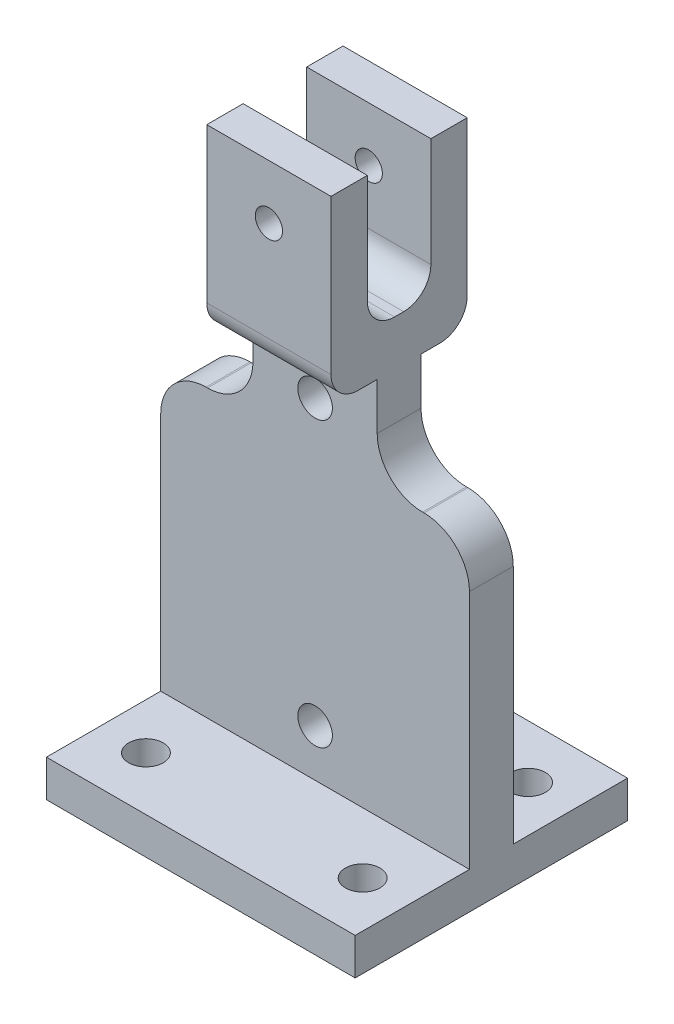
ISO-10303-21;
HEADER;
FILE_DESCRIPTION(('STEP AP214'),'2;1');
FILE_NAME('part.step','',(''),(''),'','','');
FILE_SCHEMA(('AUTOMOTIVE_DESIGN { 1 0 10303 214 1 1 1 1 }'));
ENDSEC;
DATA;
#1=APPLICATION_CONTEXT('core data for automotive mechanical design processes');
#2=APPLICATION_PROTOCOL_DEFINITION('international standard','automotive_design',2000,#1);
#3=PRODUCT_CONTEXT('',#1,'mechanical');
#4=PRODUCT('Part','Part','',(#3));
#5=PRODUCT_RELATED_PRODUCT_CATEGORY('part','',(#4));
#6=PRODUCT_DEFINITION_FORMATION('','',#4);
#7=PRODUCT_DEFINITION_CONTEXT('part definition',#1,'design');
#8=PRODUCT_DEFINITION('design','',#6,#7);
#9=PRODUCT_DEFINITION_SHAPE('','',#8);
#10=(LENGTH_UNIT() NAMED_UNIT(*) SI_UNIT(.MILLI.,.METRE.));
#11=(NAMED_UNIT(*) PLANE_ANGLE_UNIT() SI_UNIT($,.RADIAN.));
#12=(NAMED_UNIT(*) SI_UNIT($,.STERADIAN.) SOLID_ANGLE_UNIT());
#13=UNCERTAINTY_MEASURE_WITH_UNIT(LENGTH_MEASURE(1.E-05),#10,'distance_accuracy_value','');
#14=(GEOMETRIC_REPRESENTATION_CONTEXT(3) GLOBAL_UNCERTAINTY_ASSIGNED_CONTEXT((#13)) GLOBAL_UNIT_ASSIGNED_CONTEXT((#10,
#11,#12)) REPRESENTATION_CONTEXT('',''));
#15=CARTESIAN_POINT('',(0.,0.,0.));
#16=DIRECTION('',(0.,0.,1.));
#17=DIRECTION('',(1.,0.,0.));
#18=AXIS2_PLACEMENT_3D('',#15,#16,#17);
#19=CARTESIAN_POINT('',(-6.84,0.,2.413));
#20=DIRECTION('',(1.,0.,0.));
#21=DIRECTION('',(0.,0.,-1.));
#22=AXIS2_PLACEMENT_3D('',#19,#20,#21);
#23=PLANE('',#22);
#24=DIRECTION('',(0.,0.,1.));
#25=VECTOR('',#24,1.);
#26=CARTESIAN_POINT('',(-6.84,41.656,0.));
#27=LINE('',#26,#25);
#28=CARTESIAN_POINT('',(-6.84,41.656,2.413));
#29=VERTEX_POINT('',#28);
#30=CARTESIAN_POINT('',(-6.84,41.656,4.5));
#31=VERTEX_POINT('',#30);
#32=EDGE_CURVE('E302',#29,#31,#27,.T.);
#33=ORIENTED_EDGE('',*,*,#32,.T.);
#34=CARTESIAN_POINT('',(-6.84,44.656,4.5));
#35=DIRECTION('',(1.,0.,0.));
#36=DIRECTION('',(0.,0.,-1.));
#37=AXIS2_PLACEMENT_3D('',#34,#35,#36);
#38=CIRCLE('',#37,3.);
#39=CARTESIAN_POINT('',(-6.84,44.656,7.5));
#40=VERTEX_POINT('',#39);
#41=EDGE_CURVE('E528',#31,#40,#38,.F.);
#42=ORIENTED_EDGE('',*,*,#41,.T.);
#43=DIRECTION('',(0.,-1.,0.));
#44=VECTOR('',#43,1.);
#45=CARTESIAN_POINT('',(-6.84,61.656,7.5));
#46=LINE('',#45,#44);
#47=CARTESIAN_POINT('',(-6.84,61.656,7.5));
#48=VERTEX_POINT('',#47);
#49=EDGE_CURVE('E280',#48,#40,#46,.T.);
#50=ORIENTED_EDGE('',*,*,#49,.F.);
#51=DIRECTION('',(0.,0.,1.));
#52=VECTOR('',#51,1.);
#53=CARTESIAN_POINT('',(-6.84,61.656,0.));
#54=LINE('',#53,#52);
#55=CARTESIAN_POINT('',(-6.84,61.656,3.5));
#56=VERTEX_POINT('',#55);
#57=EDGE_CURVE('E258',#56,#48,#54,.T.);
#58=ORIENTED_EDGE('',*,*,#57,.F.);
#59=DIRECTION('',(0.,-1.,0.));
#60=VECTOR('',#59,1.);
#61=CARTESIAN_POINT('',(-6.84,61.656,3.5));
#62=LINE('',#61,#60);
#63=CARTESIAN_POINT('',(-6.84,49.656,3.5));
#64=VERTEX_POINT('',#63);
#65=EDGE_CURVE('E284',#56,#64,#62,.T.);
#66=ORIENTED_EDGE('',*,*,#65,.T.);
#67=CARTESIAN_POINT('',(-6.84,49.656,0.500000000000001));
#68=DIRECTION('',(1.,0.,0.));
#69=DIRECTION('',(0.,0.,-1.));
#70=AXIS2_PLACEMENT_3D('',#67,#68,#69);
#71=CIRCLE('',#70,3.);
#72=CARTESIAN_POINT('',(-6.84,46.656,0.500000000000001));
#73=VERTEX_POINT('',#72);
#74=EDGE_CURVE('E553',#64,#73,#71,.T.);
#75=ORIENTED_EDGE('',*,*,#74,.T.);
#76=DIRECTION('',(0.,0.,1.));
#77=VECTOR('',#76,1.);
#78=CARTESIAN_POINT('',(-6.84,46.656,0.));
#79=LINE('',#78,#77);
#80=CARTESIAN_POINT('',(-6.84,46.656,-0.499999999999998));
#81=VERTEX_POINT('',#80);
#82=EDGE_CURVE('E293',#81,#73,#79,.T.);
#83=ORIENTED_EDGE('',*,*,#82,.F.);
#84=CARTESIAN_POINT('',(-6.84,49.656,-0.499999999999998));
#85=DIRECTION('',(1.,0.,0.));
#86=DIRECTION('',(0.,0.,-1.));
#87=AXIS2_PLACEMENT_3D('',#84,#85,#86);
#88=CIRCLE('',#87,3.);
#89=CARTESIAN_POINT('',(-6.84,49.656,-3.5));
#90=VERTEX_POINT('',#89);
#91=EDGE_CURVE('E11',#81,#90,#88,.T.);
#92=ORIENTED_EDGE('',*,*,#91,.T.);
#93=DIRECTION('',(0.,-1.,0.));
#94=VECTOR('',#93,1.);
#95=CARTESIAN_POINT('',(-6.84,61.656,-3.5));
#96=LINE('',#95,#94);
#97=CARTESIAN_POINT('',(-6.84,61.656,-3.5));
#98=VERTEX_POINT('',#97);
#99=EDGE_CURVE('E231',#98,#90,#96,.T.);
#100=ORIENTED_EDGE('',*,*,#99,.F.);
#101=DIRECTION('',(0.,0.,1.));
#102=VECTOR('',#101,1.);
#103=CARTESIAN_POINT('',(-6.84,61.656,0.));
#104=LINE('',#103,#102);
#105=CARTESIAN_POINT('',(-6.84,61.656,-7.5));
#106=VERTEX_POINT('',#105);
#107=EDGE_CURVE('E239',#106,#98,#104,.T.);
#108=ORIENTED_EDGE('',*,*,#107,.F.);
#109=DIRECTION('',(0.,-1.,0.));
#110=VECTOR('',#109,1.);
#111=CARTESIAN_POINT('',(-6.84,61.656,-7.5));
#112=LINE('',#111,#110);
#113=CARTESIAN_POINT('',(-6.84,44.656,-7.5));
#114=VERTEX_POINT('',#113);
#115=EDGE_CURVE('E1070',#106,#114,#112,.T.);
#116=ORIENTED_EDGE('',*,*,#115,.T.);
#117=CARTESIAN_POINT('',(-6.84,44.656,-4.5));
#118=DIRECTION('',(1.,0.,0.));
#119=DIRECTION('',(0.,0.,-1.));
#120=AXIS2_PLACEMENT_3D('',#117,#118,#119);
#121=CIRCLE('',#120,3.);
#122=CARTESIAN_POINT('',(-6.84,41.656,-4.5));
#123=VERTEX_POINT('',#122);
#124=EDGE_CURVE('E57',#114,#123,#121,.F.);
#125=ORIENTED_EDGE('',*,*,#124,.T.);
#126=CARTESIAN_POINT('',(-6.84,41.656,-2.413));
#127=VERTEX_POINT('',#126);
#128=EDGE_CURVE('E294',#123,#127,#27,.T.);
#129=ORIENTED_EDGE('',*,*,#128,.T.);
#130=DIRECTION('',(0.,-1.,0.));
#131=VECTOR('',#130,1.);
#132=CARTESIAN_POINT('',(-6.84,0.,-2.413));
#133=LINE('',#132,#131);
#134=CARTESIAN_POINT('',(-6.84,36.496,-2.413));
#135=VERTEX_POINT('',#134);
#136=EDGE_CURVE('E432',#127,#135,#133,.T.);
#137=ORIENTED_EDGE('',*,*,#136,.T.);
#138=DIRECTION('',(0.,0.,-1.));
#139=VECTOR('',#138,1.);
#140=CARTESIAN_POINT('',(-6.84,36.496,2.413));
#141=LINE('',#140,#139);
#142=CARTESIAN_POINT('',(-6.84,36.496,2.413));
#143=VERTEX_POINT('',#142);
#144=EDGE_CURVE('E468',#135,#143,#141,.F.);
#145=ORIENTED_EDGE('',*,*,#144,.T.);
#146=DIRECTION('',(0.,-1.,0.));
#147=VECTOR('',#146,1.);
#148=CARTESIAN_POINT('',(-6.84,0.,2.413));
#149=LINE('',#148,#147);
#150=EDGE_CURVE('E392',#29,#143,#149,.T.);
#151=ORIENTED_EDGE('',*,*,#150,.F.);
#152=EDGE_LOOP('',(#33,#42,#50,#58,#66,#75,#83,#92,#100,#108,#116,#125,#129,#137,#145,#151));
#153=FACE_BOUND('',#152,.T.);
#154=ADVANCED_FACE('F41',(#153),#23,.F.);
#155=CARTESIAN_POINT('',(0.,31.496,2.413));
#156=DIRECTION('',(0.,-1.,0.));
#157=DIRECTION('',(0.,0.,-1.));
#158=AXIS2_PLACEMENT_3D('',#155,#156,#157);
#159=PLANE('',#158);
#160=DIRECTION('',(-1.,0.,0.));
#161=VECTOR('',#160,1.);
#162=CARTESIAN_POINT('',(0.,31.496,2.413));
#163=LINE('',#162,#161);
#164=CARTESIAN_POINT('',(-11.84,31.496,2.413));
#165=VERTEX_POINT('',#164);
#166=CARTESIAN_POINT('',(-12.,31.496,2.413));
#167=VERTEX_POINT('',#166);
#168=EDGE_CURVE('E396',#165,#167,#163,.T.);
#169=ORIENTED_EDGE('',*,*,#168,.F.);
#170=DIRECTION('',(0.,0.,-1.));
#171=VECTOR('',#170,1.);
#172=CARTESIAN_POINT('',(-11.84,31.496,-2.413));
#173=LINE('',#172,#171);
#174=CARTESIAN_POINT('',(-11.84,31.496,-2.413));
#175=VERTEX_POINT('',#174);
#176=EDGE_CURVE('E464',#165,#175,#173,.T.);
#177=ORIENTED_EDGE('',*,*,#176,.T.);
#178=DIRECTION('',(-1.,0.,0.));
#179=VECTOR('',#178,1.);
#180=CARTESIAN_POINT('',(0.,31.496,-2.413));
#181=LINE('',#180,#179);
#182=CARTESIAN_POINT('',(-12.,31.496,-2.413));
#183=VERTEX_POINT('',#182);
#184=EDGE_CURVE('E436',#175,#183,#181,.T.);
#185=ORIENTED_EDGE('',*,*,#184,.T.);
#186=DIRECTION('',(0.,0.,-1.));
#187=VECTOR('',#186,1.);
#188=CARTESIAN_POINT('',(-12.,31.496,2.413));
#189=LINE('',#188,#187);
#190=EDGE_CURVE('E424',#183,#167,#189,.F.);
#191=ORIENTED_EDGE('',*,*,#190,.T.);
#192=EDGE_LOOP('',(#169,#177,#185,#191));
#193=FACE_BOUND('',#192,.T.);
#194=ADVANCED_FACE('F575',(#193),#159,.F.);
#195=CARTESIAN_POINT('',(-17.,0.,2.413));
#196=DIRECTION('',(-1.,0.,0.));
#197=DIRECTION('',(0.,-1.,0.));
#198=AXIS2_PLACEMENT_3D('',#195,#196,#197);
#199=PLANE('',#198);
#200=DIRECTION('',(0.,1.,0.));
#201=VECTOR('',#200,1.);
#202=CARTESIAN_POINT('',(-17.,0.,2.413));
#203=LINE('',#202,#201);
#204=CARTESIAN_POINT('',(-17.,0.,2.413));
#205=VERTEX_POINT('',#204);
#206=CARTESIAN_POINT('',(-17.,26.496,2.413));
#207=VERTEX_POINT('',#206);
#208=EDGE_CURVE('E400',#205,#207,#203,.T.);
#209=ORIENTED_EDGE('',*,*,#208,.T.);
#210=DIRECTION('',(0.,0.,-1.));
#211=VECTOR('',#210,1.);
#212=CARTESIAN_POINT('',(-17.,26.496,-2.413));
#213=LINE('',#212,#211);
#214=CARTESIAN_POINT('',(-17.,26.496,-2.413));
#215=VERTEX_POINT('',#214);
#216=EDGE_CURVE('E482',#207,#215,#213,.T.);
#217=ORIENTED_EDGE('',*,*,#216,.T.);
#218=DIRECTION('',(0.,1.,0.));
#219=VECTOR('',#218,1.);
#220=CARTESIAN_POINT('',(-17.,0.,-2.413));
#221=LINE('',#220,#219);
#222=CARTESIAN_POINT('',(-17.,0.,-2.41299999999999));
#223=VERTEX_POINT('',#222);
#224=EDGE_CURVE('E440',#223,#215,#221,.T.);
#225=ORIENTED_EDGE('',*,*,#224,.F.);
#226=DIRECTION('',(0.,0.,1.));
#227=VECTOR('',#226,1.);
#228=CARTESIAN_POINT('',(-17.,0.,15.));
#229=LINE('',#228,#227);
#230=CARTESIAN_POINT('',(-17.,0.,-15.));
#231=VERTEX_POINT('',#230);
#232=EDGE_CURVE('E363',#231,#223,#229,.T.);
#233=ORIENTED_EDGE('',*,*,#232,.F.);
#234=DIRECTION('',(0.,1.,0.));
#235=VECTOR('',#234,1.);
#236=CARTESIAN_POINT('',(-17.,-4.064,-15.));
#237=LINE('',#236,#235);
#238=CARTESIAN_POINT('',(-17.,-4.064,-15.));
#239=VERTEX_POINT('',#238);
#240=EDGE_CURVE('E377',#239,#231,#237,.T.);
#241=ORIENTED_EDGE('',*,*,#240,.F.);
#242=DIRECTION('',(0.,0.,1.));
#243=VECTOR('',#242,1.);
#244=CARTESIAN_POINT('',(-17.,-4.064,15.));
#245=LINE('',#244,#243);
#246=CARTESIAN_POINT('',(-17.,-4.064,15.));
#247=VERTEX_POINT('',#246);
#248=EDGE_CURVE('E346',#239,#247,#245,.T.);
#249=ORIENTED_EDGE('',*,*,#248,.T.);
#250=DIRECTION('',(0.,1.,0.));
#251=VECTOR('',#250,1.);
#252=CARTESIAN_POINT('',(-17.,-4.064,15.));
#253=LINE('',#252,#251);
#254=CARTESIAN_POINT('',(-17.,0.,15.));
#255=VERTEX_POINT('',#254);
#256=EDGE_CURVE('E373',#247,#255,#253,.T.);
#257=ORIENTED_EDGE('',*,*,#256,.T.);
#258=EDGE_CURVE('E362',#205,#255,#229,.T.);
#259=ORIENTED_EDGE('',*,*,#258,.F.);
#260=EDGE_LOOP('',(#209,#217,#225,#233,#241,#249,#257,#259));
#261=FACE_BOUND('',#260,.T.);
#262=ADVANCED_FACE('F580',(#261),#199,.T.);
#263=CARTESIAN_POINT('',(17.,0.,2.413));
#264=DIRECTION('',(-1.,0.,0.));
#265=DIRECTION('',(0.,-1.,0.));
#266=AXIS2_PLACEMENT_3D('',#263,#264,#265);
#267=PLANE('',#266);
#268=DIRECTION('',(0.,1.,0.));
#269=VECTOR('',#268,1.);
#270=CARTESIAN_POINT('',(17.,0.,-2.413));
#271=LINE('',#270,#269);
#272=CARTESIAN_POINT('',(17.,0.,-2.413));
#273=VERTEX_POINT('',#272);
#274=CARTESIAN_POINT('',(17.,26.496,-2.413));
#275=VERTEX_POINT('',#274);
#276=EDGE_CURVE('E447',#273,#275,#271,.T.);
#277=ORIENTED_EDGE('',*,*,#276,.T.);
#278=DIRECTION('',(0.,0.,-1.));
#279=VECTOR('',#278,1.);
#280=CARTESIAN_POINT('',(17.,26.496,2.413));
#281=LINE('',#280,#279);
#282=CARTESIAN_POINT('',(17.,26.496,2.413));
#283=VERTEX_POINT('',#282);
#284=EDGE_CURVE('E498',#275,#283,#281,.F.);
#285=ORIENTED_EDGE('',*,*,#284,.T.);
#286=DIRECTION('',(0.,1.,0.));
#287=VECTOR('',#286,1.);
#288=CARTESIAN_POINT('',(17.,0.,2.413));
#289=LINE('',#288,#287);
#290=CARTESIAN_POINT('',(17.,0.,2.413));
#291=VERTEX_POINT('',#290);
#292=EDGE_CURVE('E408',#291,#283,#289,.T.);
#293=ORIENTED_EDGE('',*,*,#292,.F.);
#294=DIRECTION('',(0.,0.,-1.));
#295=VECTOR('',#294,1.);
#296=CARTESIAN_POINT('',(17.,0.,15.));
#297=LINE('',#296,#295);
#298=CARTESIAN_POINT('',(17.,0.,15.));
#299=VERTEX_POINT('',#298);
#300=EDGE_CURVE('E355',#299,#291,#297,.T.);
#301=ORIENTED_EDGE('',*,*,#300,.F.);
#302=DIRECTION('',(0.,1.,0.));
#303=VECTOR('',#302,1.);
#304=CARTESIAN_POINT('',(17.,-4.064,15.));
#305=LINE('',#304,#303);
#306=CARTESIAN_POINT('',(17.,-4.064,15.));
#307=VERTEX_POINT('',#306);
#308=EDGE_CURVE('E369',#307,#299,#305,.T.);
#309=ORIENTED_EDGE('',*,*,#308,.F.);
#310=DIRECTION('',(0.,0.,-1.));
#311=VECTOR('',#310,1.);
#312=CARTESIAN_POINT('',(17.,-4.064,15.));
#313=LINE('',#312,#311);
#314=CARTESIAN_POINT('',(17.,-4.064,-15.));
#315=VERTEX_POINT('',#314);
#316=EDGE_CURVE('E337',#307,#315,#313,.T.);
#317=ORIENTED_EDGE('',*,*,#316,.T.);
#318=DIRECTION('',(0.,1.,0.));
#319=VECTOR('',#318,1.);
#320=CARTESIAN_POINT('',(17.,-4.064,-15.));
#321=LINE('',#320,#319);
#322=CARTESIAN_POINT('',(17.,0.,-15.));
#323=VERTEX_POINT('',#322);
#324=EDGE_CURVE('E354',#315,#323,#321,.T.);
#325=ORIENTED_EDGE('',*,*,#324,.T.);
#326=EDGE_CURVE('E333',#273,#323,#297,.T.);
#327=ORIENTED_EDGE('',*,*,#326,.F.);
#328=EDGE_LOOP('',(#277,#285,#293,#301,#309,#317,#325,#327));
#329=FACE_BOUND('',#328,.T.);
#330=ADVANCED_FACE('F701',(#329),#267,.F.);
#331=CARTESIAN_POINT('',(0.,31.496,2.413));
#332=DIRECTION('',(0.,-1.,0.));
#333=DIRECTION('',(0.,0.,-1.));
#334=AXIS2_PLACEMENT_3D('',#331,#332,#333);
#335=PLANE('',#334);
#336=DIRECTION('',(-1.,0.,0.));
#337=VECTOR('',#336,1.);
#338=CARTESIAN_POINT('',(0.,31.496,-2.413));
#339=LINE('',#338,#337);
#340=CARTESIAN_POINT('',(12.,31.496,-2.413));
#341=VERTEX_POINT('',#340);
#342=CARTESIAN_POINT('',(11.84,31.496,-2.413));
#343=VERTEX_POINT('',#342);
#344=EDGE_CURVE('E451',#341,#343,#339,.T.);
#345=ORIENTED_EDGE('',*,*,#344,.T.);
#346=DIRECTION('',(0.,0.,-1.));
#347=VECTOR('',#346,1.);
#348=CARTESIAN_POINT('',(11.84,31.496,2.413));
#349=LINE('',#348,#347);
#350=CARTESIAN_POINT('',(11.84,31.496,2.413));
#351=VERTEX_POINT('',#350);
#352=EDGE_CURVE('E479',#343,#351,#349,.F.);
#353=ORIENTED_EDGE('',*,*,#352,.T.);
#354=DIRECTION('',(-1.,0.,0.));
#355=VECTOR('',#354,1.);
#356=CARTESIAN_POINT('',(0.,31.496,2.413));
#357=LINE('',#356,#355);
#358=CARTESIAN_POINT('',(12.,31.496,2.413));
#359=VERTEX_POINT('',#358);
#360=EDGE_CURVE('E412',#359,#351,#357,.T.);
#361=ORIENTED_EDGE('',*,*,#360,.F.);
#362=DIRECTION('',(0.,0.,-1.));
#363=VECTOR('',#362,1.);
#364=CARTESIAN_POINT('',(12.,31.496,2.413));
#365=LINE('',#364,#363);
#366=EDGE_CURVE('E475',#359,#341,#365,.T.);
#367=ORIENTED_EDGE('',*,*,#366,.T.);
#368=EDGE_LOOP('',(#345,#353,#361,#367));
#369=FACE_BOUND('',#368,.T.);
#370=ADVANCED_FACE('F698',(#369),#335,.F.);
#371=CARTESIAN_POINT('',(6.84,0.,2.413));
#372=DIRECTION('',(-1.,0.,0.));
#373=DIRECTION('',(0.,0.,1.));
#374=AXIS2_PLACEMENT_3D('',#371,#372,#373);
#375=PLANE('',#374);
#376=DIRECTION('',(0.,-1.,0.));
#377=VECTOR('',#376,1.);
#378=CARTESIAN_POINT('',(6.84,61.656,7.5));
#379=LINE('',#378,#377);
#380=CARTESIAN_POINT('',(6.84,61.656,7.5));
#381=VERTEX_POINT('',#380);
#382=CARTESIAN_POINT('',(6.84,44.656,7.5));
#383=VERTEX_POINT('',#382);
#384=EDGE_CURVE('E276',#381,#383,#379,.T.);
#385=ORIENTED_EDGE('',*,*,#384,.T.);
#386=CARTESIAN_POINT('',(6.84,44.656,4.5));
#387=DIRECTION('',(-1.,0.,0.));
#388=DIRECTION('',(0.,0.,1.));
#389=AXIS2_PLACEMENT_3D('',#386,#387,#388);
#390=CIRCLE('',#389,3.);
#391=CARTESIAN_POINT('',(6.84,41.656,4.5));
#392=VERTEX_POINT('',#391);
#393=EDGE_CURVE('E520',#383,#392,#390,.F.);
#394=ORIENTED_EDGE('',*,*,#393,.T.);
#395=DIRECTION('',(0.,0.,-1.));
#396=VECTOR('',#395,1.);
#397=CARTESIAN_POINT('',(6.84,41.656,0.));
#398=LINE('',#397,#396);
#399=CARTESIAN_POINT('',(6.84,41.656,2.413));
#400=VERTEX_POINT('',#399);
#401=EDGE_CURVE('E299',#392,#400,#398,.T.);
#402=ORIENTED_EDGE('',*,*,#401,.T.);
#403=DIRECTION('',(0.,1.,0.));
#404=VECTOR('',#403,1.);
#405=CARTESIAN_POINT('',(6.84,0.,2.413));
#406=LINE('',#405,#404);
#407=CARTESIAN_POINT('',(6.84,36.496,2.413));
#408=VERTEX_POINT('',#407);
#409=EDGE_CURVE('E416',#408,#400,#406,.T.);
#410=ORIENTED_EDGE('',*,*,#409,.F.);
#411=DIRECTION('',(0.,0.,-1.));
#412=VECTOR('',#411,1.);
#413=CARTESIAN_POINT('',(6.84,36.496,-2.413));
#414=LINE('',#413,#412);
#415=CARTESIAN_POINT('',(6.84,36.496,-2.413));
#416=VERTEX_POINT('',#415);
#417=EDGE_CURVE('E471',#408,#416,#414,.T.);
#418=ORIENTED_EDGE('',*,*,#417,.T.);
#419=DIRECTION('',(0.,1.,0.));
#420=VECTOR('',#419,1.);
#421=CARTESIAN_POINT('',(6.84,0.,-2.413));
#422=LINE('',#421,#420);
#423=CARTESIAN_POINT('',(6.84,41.656,-2.413));
#424=VERTEX_POINT('',#423);
#425=EDGE_CURVE('E455',#416,#424,#422,.T.);
#426=ORIENTED_EDGE('',*,*,#425,.T.);
#427=CARTESIAN_POINT('',(6.84,41.656,-4.5));
#428=VERTEX_POINT('',#427);
#429=EDGE_CURVE('E288',#424,#428,#398,.T.);
#430=ORIENTED_EDGE('',*,*,#429,.T.);
#431=CARTESIAN_POINT('',(6.84,44.656,-4.5));
#432=DIRECTION('',(-1.,0.,0.));
#433=DIRECTION('',(0.,0.,1.));
#434=AXIS2_PLACEMENT_3D('',#431,#432,#433);
#435=CIRCLE('',#434,3.);
#436=CARTESIAN_POINT('',(6.84,44.656,-7.5));
#437=VERTEX_POINT('',#436);
#438=EDGE_CURVE('E517',#428,#437,#435,.F.);
#439=ORIENTED_EDGE('',*,*,#438,.T.);
#440=DIRECTION('',(0.,-1.,0.));
#441=VECTOR('',#440,1.);
#442=CARTESIAN_POINT('',(6.84,61.656,-7.5));
#443=LINE('',#442,#441);
#444=CARTESIAN_POINT('',(6.84,61.656,-7.5));
#445=VERTEX_POINT('',#444);
#446=EDGE_CURVE('E260',#445,#437,#443,.T.);
#447=ORIENTED_EDGE('',*,*,#446,.F.);
#448=DIRECTION('',(0.,0.,-1.));
#449=VECTOR('',#448,1.);
#450=CARTESIAN_POINT('',(6.84,61.656,0.));
#451=LINE('',#450,#449);
#452=CARTESIAN_POINT('',(6.84,61.656,-3.5));
#453=VERTEX_POINT('',#452);
#454=EDGE_CURVE('E238',#453,#445,#451,.T.);
#455=ORIENTED_EDGE('',*,*,#454,.F.);
#456=DIRECTION('',(0.,-1.,0.));
#457=VECTOR('',#456,1.);
#458=CARTESIAN_POINT('',(6.84,61.656,-3.5));
#459=LINE('',#458,#457);
#460=CARTESIAN_POINT('',(6.84,49.656,-3.5));
#461=VERTEX_POINT('',#460);
#462=EDGE_CURVE('E234',#453,#461,#459,.T.);
#463=ORIENTED_EDGE('',*,*,#462,.T.);
#464=CARTESIAN_POINT('',(6.84,49.656,-0.499999999999998));
#465=DIRECTION('',(-1.,0.,0.));
#466=DIRECTION('',(0.,0.,1.));
#467=AXIS2_PLACEMENT_3D('',#464,#465,#466);
#468=CIRCLE('',#467,3.);
#469=CARTESIAN_POINT('',(6.84,46.656,-0.499999999999998));
#470=VERTEX_POINT('',#469);
#471=EDGE_CURVE('E50',#461,#470,#468,.T.);
#472=ORIENTED_EDGE('',*,*,#471,.T.);
#473=DIRECTION('',(0.,0.,-1.));
#474=VECTOR('',#473,1.);
#475=CARTESIAN_POINT('',(6.84,46.656,0.));
#476=LINE('',#475,#474);
#477=CARTESIAN_POINT('',(6.84,46.656,0.500000000000001));
#478=VERTEX_POINT('',#477);
#479=EDGE_CURVE('E289',#478,#470,#476,.T.);
#480=ORIENTED_EDGE('',*,*,#479,.F.);
#481=CARTESIAN_POINT('',(6.84,49.656,0.500000000000001));
#482=DIRECTION('',(-1.,0.,0.));
#483=DIRECTION('',(0.,0.,1.));
#484=AXIS2_PLACEMENT_3D('',#481,#482,#483);
#485=CIRCLE('',#484,3.);
#486=CARTESIAN_POINT('',(6.84,49.656,3.5));
#487=VERTEX_POINT('',#486);
#488=EDGE_CURVE('E550',#478,#487,#485,.T.);
#489=ORIENTED_EDGE('',*,*,#488,.T.);
#490=DIRECTION('',(0.,-1.,0.));
#491=VECTOR('',#490,1.);
#492=CARTESIAN_POINT('',(6.84,61.656,3.5));
#493=LINE('',#492,#491);
#494=CARTESIAN_POINT('',(6.84,61.656,3.5));
#495=VERTEX_POINT('',#494);
#496=EDGE_CURVE('E272',#495,#487,#493,.T.);
#497=ORIENTED_EDGE('',*,*,#496,.F.);
#498=DIRECTION('',(0.,0.,-1.));
#499=VECTOR('',#498,1.);
#500=CARTESIAN_POINT('',(6.84,61.656,0.));
#501=LINE('',#500,#499);
#502=EDGE_CURVE('E269',#381,#495,#501,.T.);
#503=ORIENTED_EDGE('',*,*,#502,.F.);
#504=EDGE_LOOP('',(#385,#394,#402,#410,#418,#426,#430,#439,#447,#455,#463,#472,#480,#489,#497,#503));
#505=FACE_BOUND('',#504,.T.);
#506=ADVANCED_FACE('F558',(#505),#375,.F.);
#507=CARTESIAN_POINT('',(0.,5.207,2.413));
#508=DIRECTION('',(0.,0.,-1.));
#509=DIRECTION('',(-1.,0.,0.));
#510=AXIS2_PLACEMENT_3D('',#507,#508,#509);
#511=CYLINDRICAL_SURFACE('',#510,1.905);
#512=CARTESIAN_POINT('',(0.,5.207,2.413));
#513=DIRECTION('',(0.,0.,1.));
#514=DIRECTION('',(1.,0.,0.));
#515=AXIS2_PLACEMENT_3D('',#512,#513,#514);
#516=CIRCLE('',#515,1.905);
#517=CARTESIAN_POINT('',(1.905,5.207,2.413));
#518=VERTEX_POINT('',#517);
#519=EDGE_CURVE('E387',#518,#518,#516,.T.);
#520=ORIENTED_EDGE('',*,*,#519,.T.);
#521=EDGE_LOOP('',(#520));
#522=FACE_BOUND('',#521,.T.);
#523=CARTESIAN_POINT('',(0.,5.207,-2.413));
#524=DIRECTION('',(0.,0.,1.));
#525=DIRECTION('',(1.,0.,0.));
#526=AXIS2_PLACEMENT_3D('',#523,#524,#525);
#527=CIRCLE('',#526,1.905);
#528=CARTESIAN_POINT('',(1.905,5.207,-2.413));
#529=VERTEX_POINT('',#528);
#530=EDGE_CURVE('E428',#529,#529,#527,.T.);
#531=ORIENTED_EDGE('',*,*,#530,.F.);
#532=EDGE_LOOP('',(#531));
#533=FACE_BOUND('',#532,.T.);
#534=ADVANCED_FACE('F585',(#522,#533),#511,.F.);
#535=CARTESIAN_POINT('',(0.,36.449,2.413));
#536=DIRECTION('',(0.,0.,-1.));
#537=DIRECTION('',(-1.,0.,0.));
#538=AXIS2_PLACEMENT_3D('',#535,#536,#537);
#539=CYLINDRICAL_SURFACE('',#538,1.905);
#540=CARTESIAN_POINT('',(0.,36.449,2.413));
#541=DIRECTION('',(0.,0.,1.));
#542=DIRECTION('',(1.,0.,0.));
#543=AXIS2_PLACEMENT_3D('',#540,#541,#542);
#544=CIRCLE('',#543,1.905);
#545=CARTESIAN_POINT('',(1.905,36.449,2.413));
#546=VERTEX_POINT('',#545);
#547=EDGE_CURVE('E383',#546,#546,#544,.T.);
#548=ORIENTED_EDGE('',*,*,#547,.T.);
#549=EDGE_LOOP('',(#548));
#550=FACE_BOUND('',#549,.T.);
#551=CARTESIAN_POINT('',(0.,36.449,-2.413));
#552=DIRECTION('',(0.,0.,1.));
#553=DIRECTION('',(1.,0.,0.));
#554=AXIS2_PLACEMENT_3D('',#551,#552,#553);
#555=CIRCLE('',#554,1.905);
#556=CARTESIAN_POINT('',(1.905,36.449,-2.413));
#557=VERTEX_POINT('',#556);
#558=EDGE_CURVE('E372',#557,#557,#555,.T.);
#559=ORIENTED_EDGE('',*,*,#558,.F.);
#560=EDGE_LOOP('',(#559));
#561=FACE_BOUND('',#560,.T.);
#562=ADVANCED_FACE('F588',(#550,#561),#539,.F.);
#563=CARTESIAN_POINT('',(0.,0.,2.413));
#564=DIRECTION('',(0.,0.,1.));
#565=DIRECTION('',(1.,0.,0.));
#566=AXIS2_PLACEMENT_3D('',#563,#564,#565);
#567=PLANE('',#566);
#568=ORIENTED_EDGE('',*,*,#547,.F.);
#569=EDGE_LOOP('',(#568));
#570=FACE_BOUND('',#569,.T.);
#571=ORIENTED_EDGE('',*,*,#519,.F.);
#572=EDGE_LOOP('',(#571));
#573=FACE_BOUND('',#572,.T.);
#574=ORIENTED_EDGE('',*,*,#168,.T.);
#575=CARTESIAN_POINT('',(-12.,26.496,2.413));
#576=DIRECTION('',(0.,0.,1.));
#577=DIRECTION('',(1.,0.,0.));
#578=AXIS2_PLACEMENT_3D('',#575,#576,#577);
#579=CIRCLE('',#578,5.);
#580=EDGE_CURVE('E495',#167,#207,#579,.T.);
#581=ORIENTED_EDGE('',*,*,#580,.T.);
#582=ORIENTED_EDGE('',*,*,#208,.F.);
#583=DIRECTION('',(1.,0.,0.));
#584=VECTOR('',#583,1.);
#585=CARTESIAN_POINT('',(0.,0.,2.413));
#586=LINE('',#585,#584);
#587=EDGE_CURVE('E404',#205,#291,#586,.T.);
#588=ORIENTED_EDGE('',*,*,#587,.T.);
#589=ORIENTED_EDGE('',*,*,#292,.T.);
#590=CARTESIAN_POINT('',(12.,26.496,2.413));
#591=DIRECTION('',(0.,0.,1.));
#592=DIRECTION('',(1.,0.,0.));
#593=AXIS2_PLACEMENT_3D('',#590,#591,#592);
#594=CIRCLE('',#593,5.);
#595=EDGE_CURVE('E492',#283,#359,#594,.T.);
#596=ORIENTED_EDGE('',*,*,#595,.T.);
#597=ORIENTED_EDGE('',*,*,#360,.T.);
#598=CARTESIAN_POINT('',(11.84,36.496,2.413));
#599=DIRECTION('',(0.,0.,1.));
#600=DIRECTION('',(1.,0.,0.));
#601=AXIS2_PLACEMENT_3D('',#598,#599,#600);
#602=CIRCLE('',#601,5.);
#603=EDGE_CURVE('E510',#351,#408,#602,.F.);
#604=ORIENTED_EDGE('',*,*,#603,.T.);
#605=ORIENTED_EDGE('',*,*,#409,.T.);
#606=DIRECTION('',(-1.,0.,0.));
#607=VECTOR('',#606,1.);
#608=CARTESIAN_POINT('',(0.,41.656,2.413));
#609=LINE('',#608,#607);
#610=EDGE_CURVE('E420',#400,#29,#609,.T.);
#611=ORIENTED_EDGE('',*,*,#610,.T.);
#612=ORIENTED_EDGE('',*,*,#150,.T.);
#613=CARTESIAN_POINT('',(-11.84,36.496,2.413));
#614=DIRECTION('',(0.,0.,1.));
#615=DIRECTION('',(1.,0.,0.));
#616=AXIS2_PLACEMENT_3D('',#613,#614,#615);
#617=CIRCLE('',#616,5.);
#618=EDGE_CURVE('E504',#143,#165,#617,.F.);
#619=ORIENTED_EDGE('',*,*,#618,.T.);
#620=EDGE_LOOP('',(#574,#581,#582,#588,#589,#596,#597,#604,#605,#611,#612,#619));
#621=FACE_BOUND('',#620,.T.);
#622=ADVANCED_FACE('F592',(#570,#573,#621),#567,.T.);
#623=CARTESIAN_POINT('',(0.,0.,-2.413));
#624=DIRECTION('',(0.,0.,1.));
#625=DIRECTION('',(1.,0.,0.));
#626=AXIS2_PLACEMENT_3D('',#623,#624,#625);
#627=PLANE('',#626);
#628=ORIENTED_EDGE('',*,*,#558,.T.);
#629=EDGE_LOOP('',(#628));
#630=FACE_BOUND('',#629,.T.);
#631=ORIENTED_EDGE('',*,*,#530,.T.);
#632=EDGE_LOOP('',(#631));
#633=FACE_BOUND('',#632,.T.);
#634=ORIENTED_EDGE('',*,*,#224,.T.);
#635=CARTESIAN_POINT('',(-12.,26.496,-2.413));
#636=DIRECTION('',(0.,0.,1.));
#637=DIRECTION('',(1.,0.,0.));
#638=AXIS2_PLACEMENT_3D('',#635,#636,#637);
#639=CIRCLE('',#638,5.);
#640=EDGE_CURVE('E489',#215,#183,#639,.F.);
#641=ORIENTED_EDGE('',*,*,#640,.T.);
#642=ORIENTED_EDGE('',*,*,#184,.F.);
#643=CARTESIAN_POINT('',(-11.84,36.496,-2.413));
#644=DIRECTION('',(0.,0.,1.));
#645=DIRECTION('',(1.,0.,0.));
#646=AXIS2_PLACEMENT_3D('',#643,#644,#645);
#647=CIRCLE('',#646,5.);
#648=EDGE_CURVE('E501',#175,#135,#647,.T.);
#649=ORIENTED_EDGE('',*,*,#648,.T.);
#650=ORIENTED_EDGE('',*,*,#136,.F.);
#651=DIRECTION('',(-1.,0.,0.));
#652=VECTOR('',#651,1.);
#653=CARTESIAN_POINT('',(0.,41.656,-2.413));
#654=LINE('',#653,#652);
#655=EDGE_CURVE('E388',#424,#127,#654,.T.);
#656=ORIENTED_EDGE('',*,*,#655,.F.);
#657=ORIENTED_EDGE('',*,*,#425,.F.);
#658=CARTESIAN_POINT('',(11.84,36.496,-2.413));
#659=DIRECTION('',(0.,0.,1.));
#660=DIRECTION('',(1.,0.,0.));
#661=AXIS2_PLACEMENT_3D('',#658,#659,#660);
#662=CIRCLE('',#661,5.);
#663=EDGE_CURVE('E507',#416,#343,#662,.T.);
#664=ORIENTED_EDGE('',*,*,#663,.T.);
#665=ORIENTED_EDGE('',*,*,#344,.F.);
#666=CARTESIAN_POINT('',(12.,26.496,-2.413));
#667=DIRECTION('',(0.,0.,1.));
#668=DIRECTION('',(1.,0.,0.));
#669=AXIS2_PLACEMENT_3D('',#666,#667,#668);
#670=CIRCLE('',#669,5.);
#671=EDGE_CURVE('E486',#341,#275,#670,.F.);
#672=ORIENTED_EDGE('',*,*,#671,.T.);
#673=ORIENTED_EDGE('',*,*,#276,.F.);
#674=DIRECTION('',(1.,0.,0.));
#675=VECTOR('',#674,1.);
#676=CARTESIAN_POINT('',(0.,0.,-2.413));
#677=LINE('',#676,#675);
#678=EDGE_CURVE('E444',#223,#273,#677,.T.);
#679=ORIENTED_EDGE('',*,*,#678,.F.);
#680=EDGE_LOOP('',(#634,#641,#642,#649,#650,#656,#657,#664,#665,#672,#673,#679));
#681=FACE_BOUND('',#680,.T.);
#682=ADVANCED_FACE('F691',(#630,#633,#681),#627,.F.);
#683=CARTESIAN_POINT('',(0.,0.,0.));
#684=DIRECTION('',(0.,-1.,0.));
#685=DIRECTION('',(0.,0.,-1.));
#686=AXIS2_PLACEMENT_3D('',#683,#684,#685);
#687=PLANE('',#686);
#688=CARTESIAN_POINT('',(11.935,0.,-9.10999999999999));
#689=DIRECTION('',(0.,1.,0.));
#690=DIRECTION('',(0.,0.,1.));
#691=AXIS2_PLACEMENT_3D('',#688,#689,#690);
#692=CIRCLE('',#691,1.90499999999999);
#693=CARTESIAN_POINT('',(11.935,0.,-7.205));
#694=VERTEX_POINT('',#693);
#695=EDGE_CURVE('E309',#694,#694,#692,.T.);
#696=ORIENTED_EDGE('',*,*,#695,.F.);
#697=EDGE_LOOP('',(#696));
#698=FACE_BOUND('',#697,.T.);
#699=CARTESIAN_POINT('',(-11.935,0.,-9.10999999999999));
#700=DIRECTION('',(0.,1.,0.));
#701=DIRECTION('',(0.,0.,1.));
#702=AXIS2_PLACEMENT_3D('',#699,#700,#701);
#703=CIRCLE('',#702,1.90499999999999);
#704=CARTESIAN_POINT('',(-11.935,0.,-7.205));
#705=VERTEX_POINT('',#704);
#706=EDGE_CURVE('E298',#705,#705,#703,.T.);
#707=ORIENTED_EDGE('',*,*,#706,.F.);
#708=EDGE_LOOP('',(#707));
#709=FACE_BOUND('',#708,.T.);
#710=ORIENTED_EDGE('',*,*,#232,.T.);
#711=ORIENTED_EDGE('',*,*,#678,.T.);
#712=ORIENTED_EDGE('',*,*,#326,.T.);
#713=DIRECTION('',(-1.,0.,0.));
#714=VECTOR('',#713,1.);
#715=CARTESIAN_POINT('',(-17.,0.,-15.));
#716=LINE('',#715,#714);
#717=EDGE_CURVE('E358',#323,#231,#716,.T.);
#718=ORIENTED_EDGE('',*,*,#717,.T.);
#719=EDGE_LOOP('',(#710,#711,#712,#718));
#720=FACE_BOUND('',#719,.T.);
#721=ADVANCED_FACE('F681',(#698,#709,#720),#687,.F.);
#722=CARTESIAN_POINT('',(-17.,-4.064,15.));
#723=DIRECTION('',(0.,0.,1.));
#724=DIRECTION('',(1.,0.,0.));
#725=AXIS2_PLACEMENT_3D('',#722,#723,#724);
#726=PLANE('',#725);
#727=DIRECTION('',(1.,0.,0.));
#728=VECTOR('',#727,1.);
#729=CARTESIAN_POINT('',(-17.,0.,15.));
#730=LINE('',#729,#728);
#731=EDGE_CURVE('E342',#255,#299,#730,.T.);
#732=ORIENTED_EDGE('',*,*,#731,.F.);
#733=ORIENTED_EDGE('',*,*,#256,.F.);
#734=DIRECTION('',(1.,0.,0.));
#735=VECTOR('',#734,1.);
#736=CARTESIAN_POINT('',(-17.,-4.064,15.));
#737=LINE('',#736,#735);
#738=EDGE_CURVE('E350',#247,#307,#737,.T.);
#739=ORIENTED_EDGE('',*,*,#738,.T.);
#740=ORIENTED_EDGE('',*,*,#308,.T.);
#741=EDGE_LOOP('',(#732,#733,#739,#740));
#742=FACE_BOUND('',#741,.T.);
#743=ADVANCED_FACE('F682',(#742),#726,.T.);
#744=CARTESIAN_POINT('',(-17.,-4.064,-15.));
#745=DIRECTION('',(0.,0.,-1.));
#746=DIRECTION('',(-1.,0.,0.));
#747=AXIS2_PLACEMENT_3D('',#744,#745,#746);
#748=PLANE('',#747);
#749=ORIENTED_EDGE('',*,*,#717,.F.);
#750=ORIENTED_EDGE('',*,*,#324,.F.);
#751=DIRECTION('',(-1.,0.,0.));
#752=VECTOR('',#751,1.);
#753=CARTESIAN_POINT('',(-17.,-4.064,-15.));
#754=LINE('',#753,#752);
#755=EDGE_CURVE('E341',#315,#239,#754,.T.);
#756=ORIENTED_EDGE('',*,*,#755,.T.);
#757=ORIENTED_EDGE('',*,*,#240,.T.);
#758=EDGE_LOOP('',(#749,#750,#756,#757));
#759=FACE_BOUND('',#758,.T.);
#760=ADVANCED_FACE('F676',(#759),#748,.T.);
#761=CARTESIAN_POINT('',(0.,-4.064,0.));
#762=DIRECTION('',(0.,-1.,0.));
#763=DIRECTION('',(0.,0.,-1.));
#764=AXIS2_PLACEMENT_3D('',#761,#762,#763);
#765=PLANE('',#764);
#766=CARTESIAN_POINT('',(-11.935,-4.064,-9.10999999999999));
#767=DIRECTION('',(0.,1.,0.));
#768=DIRECTION('',(0.,0.,1.));
#769=AXIS2_PLACEMENT_3D('',#766,#767,#768);
#770=CIRCLE('',#769,1.90499999999999);
#771=CARTESIAN_POINT('',(-11.935,-4.064,-7.205));
#772=VERTEX_POINT('',#771);
#773=EDGE_CURVE('E305',#772,#772,#770,.T.);
#774=ORIENTED_EDGE('',*,*,#773,.T.);
#775=EDGE_LOOP('',(#774));
#776=FACE_BOUND('',#775,.T.);
#777=CARTESIAN_POINT('',(11.935,-4.064,-9.10999999999999));
#778=DIRECTION('',(0.,1.,0.));
#779=DIRECTION('',(0.,0.,1.));
#780=AXIS2_PLACEMENT_3D('',#777,#778,#779);
#781=CIRCLE('',#780,1.90499999999999);
#782=CARTESIAN_POINT('',(11.935,-4.064,-7.205));
#783=VERTEX_POINT('',#782);
#784=EDGE_CURVE('E313',#783,#783,#781,.T.);
#785=ORIENTED_EDGE('',*,*,#784,.T.);
#786=EDGE_LOOP('',(#785));
#787=FACE_BOUND('',#786,.T.);
#788=CARTESIAN_POINT('',(11.935,-4.064,9.11));
#789=DIRECTION('',(0.,1.,0.));
#790=DIRECTION('',(0.,0.,1.));
#791=AXIS2_PLACEMENT_3D('',#788,#789,#790);
#792=CIRCLE('',#791,1.90499999999999);
#793=CARTESIAN_POINT('',(11.935,-4.064,11.015));
#794=VERTEX_POINT('',#793);
#795=EDGE_CURVE('E321',#794,#794,#792,.T.);
#796=ORIENTED_EDGE('',*,*,#795,.T.);
#797=EDGE_LOOP('',(#796));
#798=FACE_BOUND('',#797,.T.);
#799=CARTESIAN_POINT('',(-11.935,-4.064,9.11));
#800=DIRECTION('',(0.,1.,0.));
#801=DIRECTION('',(0.,0.,1.));
#802=AXIS2_PLACEMENT_3D('',#799,#800,#801);
#803=CIRCLE('',#802,1.90499999999999);
#804=CARTESIAN_POINT('',(-11.935,-4.064,11.015));
#805=VERTEX_POINT('',#804);
#806=EDGE_CURVE('E329',#805,#805,#803,.T.);
#807=ORIENTED_EDGE('',*,*,#806,.T.);
#808=EDGE_LOOP('',(#807));
#809=FACE_BOUND('',#808,.T.);
#810=ORIENTED_EDGE('',*,*,#316,.F.);
#811=ORIENTED_EDGE('',*,*,#738,.F.);
#812=ORIENTED_EDGE('',*,*,#248,.F.);
#813=ORIENTED_EDGE('',*,*,#755,.F.);
#814=EDGE_LOOP('',(#810,#811,#812,#813));
#815=FACE_BOUND('',#814,.T.);
#816=ADVANCED_FACE('F673',(#776,#787,#798,#809,#815),#765,.T.);
#817=ORIENTED_EDGE('',*,*,#587,.F.);
#818=ORIENTED_EDGE('',*,*,#258,.T.);
#819=ORIENTED_EDGE('',*,*,#731,.T.);
#820=ORIENTED_EDGE('',*,*,#300,.T.);
#821=EDGE_LOOP('',(#817,#818,#819,#820));
#822=FACE_BOUND('',#821,.T.);
#823=CARTESIAN_POINT('',(11.935,0.,9.11));
#824=DIRECTION('',(0.,1.,0.));
#825=DIRECTION('',(0.,0.,1.));
#826=AXIS2_PLACEMENT_3D('',#823,#824,#825);
#827=CIRCLE('',#826,1.90499999999999);
#828=CARTESIAN_POINT('',(11.935,0.,11.015));
#829=VERTEX_POINT('',#828);
#830=EDGE_CURVE('E317',#829,#829,#827,.T.);
#831=ORIENTED_EDGE('',*,*,#830,.F.);
#832=EDGE_LOOP('',(#831));
#833=FACE_BOUND('',#832,.T.);
#834=CARTESIAN_POINT('',(-11.935,0.,9.11));
#835=DIRECTION('',(0.,1.,0.));
#836=DIRECTION('',(0.,0.,1.));
#837=AXIS2_PLACEMENT_3D('',#834,#835,#836);
#838=CIRCLE('',#837,1.90499999999999);
#839=CARTESIAN_POINT('',(-11.935,0.,11.015));
#840=VERTEX_POINT('',#839);
#841=EDGE_CURVE('E325',#840,#840,#838,.T.);
#842=ORIENTED_EDGE('',*,*,#841,.F.);
#843=EDGE_LOOP('',(#842));
#844=FACE_BOUND('',#843,.T.);
#845=ADVANCED_FACE('F671',(#822,#833,#844),#687,.F.);
#846=CARTESIAN_POINT('',(-11.935,-4.064,9.11));
#847=DIRECTION('',(0.,1.,0.));
#848=DIRECTION('',(0.,0.,1.));
#849=AXIS2_PLACEMENT_3D('',#846,#847,#848);
#850=CYLINDRICAL_SURFACE('',#849,1.90499999999999);
#851=ORIENTED_EDGE('',*,*,#806,.F.);
#852=EDGE_LOOP('',(#851));
#853=FACE_BOUND('',#852,.T.);
#854=ORIENTED_EDGE('',*,*,#841,.T.);
#855=EDGE_LOOP('',(#854));
#856=FACE_BOUND('',#855,.T.);
#857=ADVANCED_FACE('F667',(#853,#856),#850,.F.);
#858=CARTESIAN_POINT('',(11.935,-4.064,9.11));
#859=DIRECTION('',(0.,1.,0.));
#860=DIRECTION('',(0.,0.,1.));
#861=AXIS2_PLACEMENT_3D('',#858,#859,#860);
#862=CYLINDRICAL_SURFACE('',#861,1.90499999999999);
#863=ORIENTED_EDGE('',*,*,#795,.F.);
#864=EDGE_LOOP('',(#863));
#865=FACE_BOUND('',#864,.T.);
#866=ORIENTED_EDGE('',*,*,#830,.T.);
#867=EDGE_LOOP('',(#866));
#868=FACE_BOUND('',#867,.T.);
#869=ADVANCED_FACE('F663',(#865,#868),#862,.F.);
#870=CARTESIAN_POINT('',(11.935,-4.064,-9.10999999999999));
#871=DIRECTION('',(0.,1.,0.));
#872=DIRECTION('',(0.,0.,1.));
#873=AXIS2_PLACEMENT_3D('',#870,#871,#872);
#874=CYLINDRICAL_SURFACE('',#873,1.90499999999999);
#875=ORIENTED_EDGE('',*,*,#784,.F.);
#876=EDGE_LOOP('',(#875));
#877=FACE_BOUND('',#876,.T.);
#878=ORIENTED_EDGE('',*,*,#695,.T.);
#879=EDGE_LOOP('',(#878));
#880=FACE_BOUND('',#879,.T.);
#881=ADVANCED_FACE('F659',(#877,#880),#874,.F.);
#882=CARTESIAN_POINT('',(-11.935,-4.064,-9.10999999999999));
#883=DIRECTION('',(0.,1.,0.));
#884=DIRECTION('',(0.,0.,1.));
#885=AXIS2_PLACEMENT_3D('',#882,#883,#884);
#886=CYLINDRICAL_SURFACE('',#885,1.90499999999999);
#887=ORIENTED_EDGE('',*,*,#773,.F.);
#888=EDGE_LOOP('',(#887));
#889=FACE_BOUND('',#888,.T.);
#890=ORIENTED_EDGE('',*,*,#706,.T.);
#891=EDGE_LOOP('',(#890));
#892=FACE_BOUND('',#891,.T.);
#893=ADVANCED_FACE('F598',(#889,#892),#886,.F.);
#894=CARTESIAN_POINT('',(-11.84,36.496,2.413));
#895=DIRECTION('',(0.,0.,1.));
#896=DIRECTION('',(1.,0.,0.));
#897=AXIS2_PLACEMENT_3D('',#894,#895,#896);
#898=CYLINDRICAL_SURFACE('',#897,5.);
#899=ORIENTED_EDGE('',*,*,#618,.F.);
#900=ORIENTED_EDGE('',*,*,#144,.F.);
#901=ORIENTED_EDGE('',*,*,#648,.F.);
#902=ORIENTED_EDGE('',*,*,#176,.F.);
#903=EDGE_LOOP('',(#899,#900,#901,#902));
#904=FACE_BOUND('',#903,.T.);
#905=ADVANCED_FACE('F594',(#904),#898,.F.);
#906=CARTESIAN_POINT('',(11.84,36.496,2.413));
#907=DIRECTION('',(0.,0.,1.));
#908=DIRECTION('',(1.,0.,0.));
#909=AXIS2_PLACEMENT_3D('',#906,#907,#908);
#910=CYLINDRICAL_SURFACE('',#909,5.);
#911=ORIENTED_EDGE('',*,*,#603,.F.);
#912=ORIENTED_EDGE('',*,*,#352,.F.);
#913=ORIENTED_EDGE('',*,*,#663,.F.);
#914=ORIENTED_EDGE('',*,*,#417,.F.);
#915=EDGE_LOOP('',(#911,#912,#913,#914));
#916=FACE_BOUND('',#915,.T.);
#917=ADVANCED_FACE('F597',(#916),#910,.F.);
#918=CARTESIAN_POINT('',(-12.,26.496,2.413));
#919=DIRECTION('',(0.,0.,1.));
#920=DIRECTION('',(1.,0.,0.));
#921=AXIS2_PLACEMENT_3D('',#918,#919,#920);
#922=CYLINDRICAL_SURFACE('',#921,5.);
#923=ORIENTED_EDGE('',*,*,#580,.F.);
#924=ORIENTED_EDGE('',*,*,#190,.F.);
#925=ORIENTED_EDGE('',*,*,#640,.F.);
#926=ORIENTED_EDGE('',*,*,#216,.F.);
#927=EDGE_LOOP('',(#923,#924,#925,#926));
#928=FACE_BOUND('',#927,.T.);
#929=ADVANCED_FACE('F602',(#928),#922,.T.);
#930=CARTESIAN_POINT('',(12.,26.496,2.413));
#931=DIRECTION('',(0.,0.,-1.));
#932=DIRECTION('',(-1.,0.,0.));
#933=AXIS2_PLACEMENT_3D('',#930,#931,#932);
#934=CYLINDRICAL_SURFACE('',#933,5.);
#935=ORIENTED_EDGE('',*,*,#595,.F.);
#936=ORIENTED_EDGE('',*,*,#284,.F.);
#937=ORIENTED_EDGE('',*,*,#671,.F.);
#938=ORIENTED_EDGE('',*,*,#366,.F.);
#939=EDGE_LOOP('',(#935,#936,#937,#938));
#940=FACE_BOUND('',#939,.T.);
#941=ADVANCED_FACE('F606',(#940),#934,.T.);
#942=CARTESIAN_POINT('',(0.,41.656,0.));
#943=DIRECTION('',(0.,1.,0.));
#944=DIRECTION('',(0.,0.,1.));
#945=AXIS2_PLACEMENT_3D('',#942,#943,#944);
#946=PLANE('',#945);
#947=ORIENTED_EDGE('',*,*,#128,.F.);
#948=DIRECTION('',(-1.,0.,0.));
#949=VECTOR('',#948,1.);
#950=CARTESIAN_POINT('',(0.,41.656,-4.5));
#951=LINE('',#950,#949);
#952=EDGE_CURVE('E547',#123,#428,#951,.F.);
#953=ORIENTED_EDGE('',*,*,#952,.T.);
#954=ORIENTED_EDGE('',*,*,#429,.F.);
#955=ORIENTED_EDGE('',*,*,#655,.T.);
#956=EDGE_LOOP('',(#947,#953,#954,#955));
#957=FACE_BOUND('',#956,.T.);
#958=ADVANCED_FACE('F610',(#957),#946,.F.);
#959=CARTESIAN_POINT('',(0.,46.656,0.));
#960=DIRECTION('',(0.,1.,0.));
#961=DIRECTION('',(0.,0.,1.));
#962=AXIS2_PLACEMENT_3D('',#959,#960,#961);
#963=PLANE('',#962);
#964=ORIENTED_EDGE('',*,*,#82,.T.);
#965=DIRECTION('',(1.,0.,0.));
#966=VECTOR('',#965,1.);
#967=CARTESIAN_POINT('',(6.84,46.656,0.500000000000001));
#968=LINE('',#967,#966);
#969=EDGE_CURVE('E534',#73,#478,#968,.T.);
#970=ORIENTED_EDGE('',*,*,#969,.T.);
#971=ORIENTED_EDGE('',*,*,#479,.T.);
#972=DIRECTION('',(1.,0.,0.));
#973=VECTOR('',#972,1.);
#974=CARTESIAN_POINT('',(0.,46.656,-0.499999999999998));
#975=LINE('',#974,#973);
#976=EDGE_CURVE('E531',#470,#81,#975,.F.);
#977=ORIENTED_EDGE('',*,*,#976,.T.);
#978=EDGE_LOOP('',(#964,#970,#971,#977));
#979=FACE_BOUND('',#978,.T.);
#980=ADVANCED_FACE('F562',(#979),#963,.T.);
#981=ORIENTED_EDGE('',*,*,#401,.F.);
#982=DIRECTION('',(1.,0.,0.));
#983=VECTOR('',#982,1.);
#984=CARTESIAN_POINT('',(0.,41.656,4.5));
#985=LINE('',#984,#983);
#986=EDGE_CURVE('E523',#392,#31,#985,.F.);
#987=ORIENTED_EDGE('',*,*,#986,.T.);
#988=ORIENTED_EDGE('',*,*,#32,.F.);
#989=ORIENTED_EDGE('',*,*,#610,.F.);
#990=EDGE_LOOP('',(#981,#987,#988,#989));
#991=FACE_BOUND('',#990,.T.);
#992=ADVANCED_FACE('F641',(#991),#946,.F.);
#993=CARTESIAN_POINT('',(0.,61.656,3.5));
#994=DIRECTION('',(0.,0.,-1.));
#995=DIRECTION('',(-1.,0.,0.));
#996=AXIS2_PLACEMENT_3D('',#993,#994,#995);
#997=PLANE('',#996);
#998=CARTESIAN_POINT('',(0.,55.656,3.5));
#999=DIRECTION('',(0.,0.,-1.));
#1000=DIRECTION('',(-1.,0.,0.));
#1001=AXIS2_PLACEMENT_3D('',#998,#999,#1000);
#1002=CIRCLE('',#1001,1.5);
#1003=CARTESIAN_POINT('',(-1.5,55.656,3.5));
#1004=VERTEX_POINT('',#1003);
#1005=EDGE_CURVE('E247',#1004,#1004,#1002,.T.);
#1006=ORIENTED_EDGE('',*,*,#1005,.F.);
#1007=EDGE_LOOP('',(#1006));
#1008=FACE_BOUND('',#1007,.T.);
#1009=ORIENTED_EDGE('',*,*,#496,.T.);
#1010=DIRECTION('',(1.,0.,0.));
#1011=VECTOR('',#1010,1.);
#1012=CARTESIAN_POINT('',(-6.84,49.656,3.5));
#1013=LINE('',#1012,#1011);
#1014=EDGE_CURVE('E538',#487,#64,#1013,.F.);
#1015=ORIENTED_EDGE('',*,*,#1014,.T.);
#1016=ORIENTED_EDGE('',*,*,#65,.F.);
#1017=DIRECTION('',(1.,0.,0.));
#1018=VECTOR('',#1017,1.);
#1019=CARTESIAN_POINT('',(0.,61.656,3.5));
#1020=LINE('',#1019,#1018);
#1021=EDGE_CURVE('E253',#56,#495,#1020,.T.);
#1022=ORIENTED_EDGE('',*,*,#1021,.T.);
#1023=EDGE_LOOP('',(#1009,#1015,#1016,#1022));
#1024=FACE_BOUND('',#1023,.T.);
#1025=ADVANCED_FACE('F639',(#1008,#1024),#997,.T.);
#1026=CARTESIAN_POINT('',(0.,61.656,7.5));
#1027=DIRECTION('',(0.,0.,-1.));
#1028=DIRECTION('',(-1.,0.,0.));
#1029=AXIS2_PLACEMENT_3D('',#1026,#1027,#1028);
#1030=PLANE('',#1029);
#1031=CARTESIAN_POINT('',(0.,55.656,7.5));
#1032=DIRECTION('',(0.,0.,-1.));
#1033=DIRECTION('',(-1.,0.,0.));
#1034=AXIS2_PLACEMENT_3D('',#1031,#1032,#1033);
#1035=CIRCLE('',#1034,1.5);
#1036=CARTESIAN_POINT('',(-1.50000000000001,55.656,7.5));
#1037=VERTEX_POINT('',#1036);
#1038=EDGE_CURVE('E1056',#1037,#1037,#1035,.F.);
#1039=ORIENTED_EDGE('',*,*,#1038,.F.);
#1040=EDGE_LOOP('',(#1039));
#1041=FACE_BOUND('',#1040,.T.);
#1042=ORIENTED_EDGE('',*,*,#49,.T.);
#1043=DIRECTION('',(1.,0.,0.));
#1044=VECTOR('',#1043,1.);
#1045=CARTESIAN_POINT('',(0.,44.656,7.5));
#1046=LINE('',#1045,#1044);
#1047=EDGE_CURVE('E513',#40,#383,#1046,.T.);
#1048=ORIENTED_EDGE('',*,*,#1047,.T.);
#1049=ORIENTED_EDGE('',*,*,#384,.F.);
#1050=DIRECTION('',(1.,0.,0.));
#1051=VECTOR('',#1050,1.);
#1052=CARTESIAN_POINT('',(0.,61.656,7.5));
#1053=LINE('',#1052,#1051);
#1054=EDGE_CURVE('E266',#48,#381,#1053,.T.);
#1055=ORIENTED_EDGE('',*,*,#1054,.F.);
#1056=EDGE_LOOP('',(#1042,#1048,#1049,#1055));
#1057=FACE_BOUND('',#1056,.T.);
#1058=ADVANCED_FACE('F629',(#1041,#1057),#1030,.F.);
#1059=CARTESIAN_POINT('',(0.,61.656,0.));
#1060=DIRECTION('',(0.,1.,0.));
#1061=DIRECTION('',(0.,0.,1.));
#1062=AXIS2_PLACEMENT_3D('',#1059,#1060,#1061);
#1063=PLANE('',#1062);
#1064=ORIENTED_EDGE('',*,*,#1021,.F.);
#1065=ORIENTED_EDGE('',*,*,#57,.T.);
#1066=ORIENTED_EDGE('',*,*,#1054,.T.);
#1067=ORIENTED_EDGE('',*,*,#502,.T.);
#1068=EDGE_LOOP('',(#1064,#1065,#1066,#1067));
#1069=FACE_BOUND('',#1068,.T.);
#1070=ADVANCED_FACE('F634',(#1069),#1063,.T.);
#1071=CARTESIAN_POINT('',(0.,61.656,-3.5));
#1072=DIRECTION('',(0.,0.,-1.));
#1073=DIRECTION('',(-1.,0.,0.));
#1074=AXIS2_PLACEMENT_3D('',#1071,#1072,#1073);
#1075=PLANE('',#1074);
#1076=CARTESIAN_POINT('',(0.,55.656,-3.5));
#1077=DIRECTION('',(0.,0.,-1.));
#1078=DIRECTION('',(-1.,0.,0.));
#1079=AXIS2_PLACEMENT_3D('',#1076,#1077,#1078);
#1080=CIRCLE('',#1079,1.5);
#1081=CARTESIAN_POINT('',(-1.5,55.656,-3.5));
#1082=VERTEX_POINT('',#1081);
#1083=EDGE_CURVE('E1054',#1082,#1082,#1080,.T.);
#1084=ORIENTED_EDGE('',*,*,#1083,.T.);
#1085=EDGE_LOOP('',(#1084));
#1086=FACE_BOUND('',#1085,.T.);
#1087=ORIENTED_EDGE('',*,*,#99,.T.);
#1088=DIRECTION('',(1.,0.,0.));
#1089=VECTOR('',#1088,1.);
#1090=CARTESIAN_POINT('',(0.,49.656,-3.5));
#1091=LINE('',#1090,#1089);
#1092=EDGE_CURVE('E541',#90,#461,#1091,.T.);
#1093=ORIENTED_EDGE('',*,*,#1092,.T.);
#1094=ORIENTED_EDGE('',*,*,#462,.F.);
#1095=DIRECTION('',(1.,0.,0.));
#1096=VECTOR('',#1095,1.);
#1097=CARTESIAN_POINT('',(0.,61.656,-3.5));
#1098=LINE('',#1097,#1096);
#1099=EDGE_CURVE('E226',#98,#453,#1098,.T.);
#1100=ORIENTED_EDGE('',*,*,#1099,.F.);
#1101=EDGE_LOOP('',(#1087,#1093,#1094,#1100));
#1102=FACE_BOUND('',#1101,.T.);
#1103=ADVANCED_FACE('F228',(#1086,#1102),#1075,.F.);
#1104=CARTESIAN_POINT('',(0.,61.656,-7.5));
#1105=DIRECTION('',(0.,0.,1.));
#1106=DIRECTION('',(1.,0.,0.));
#1107=AXIS2_PLACEMENT_3D('',#1104,#1105,#1106);
#1108=PLANE('',#1107);
#1109=CARTESIAN_POINT('',(0.,55.656,-7.5));
#1110=DIRECTION('',(0.,0.,-1.));
#1111=DIRECTION('',(-1.,0.,0.));
#1112=AXIS2_PLACEMENT_3D('',#1109,#1110,#1111);
#1113=CIRCLE('',#1112,1.5);
#1114=CARTESIAN_POINT('',(-1.5,55.656,-7.5));
#1115=VERTEX_POINT('',#1114);
#1116=EDGE_CURVE('E1051',#1115,#1115,#1113,.T.);
#1117=ORIENTED_EDGE('',*,*,#1116,.F.);
#1118=EDGE_LOOP('',(#1117));
#1119=FACE_BOUND('',#1118,.T.);
#1120=ORIENTED_EDGE('',*,*,#446,.T.);
#1121=DIRECTION('',(-1.,0.,0.));
#1122=VECTOR('',#1121,1.);
#1123=CARTESIAN_POINT('',(0.,44.656,-7.5));
#1124=LINE('',#1123,#1122);
#1125=EDGE_CURVE('E544',#437,#114,#1124,.T.);
#1126=ORIENTED_EDGE('',*,*,#1125,.T.);
#1127=ORIENTED_EDGE('',*,*,#115,.F.);
#1128=DIRECTION('',(-1.,0.,0.));
#1129=VECTOR('',#1128,1.);
#1130=CARTESIAN_POINT('',(0.,61.656,-7.5));
#1131=LINE('',#1130,#1129);
#1132=EDGE_CURVE('E244',#445,#106,#1131,.T.);
#1133=ORIENTED_EDGE('',*,*,#1132,.F.);
#1134=EDGE_LOOP('',(#1120,#1126,#1127,#1133));
#1135=FACE_BOUND('',#1134,.T.);
#1136=ADVANCED_FACE('F855',(#1119,#1135),#1108,.F.);
#1137=CARTESIAN_POINT('',(0.,61.656,0.));
#1138=DIRECTION('',(0.,1.,0.));
#1139=DIRECTION('',(0.,0.,1.));
#1140=AXIS2_PLACEMENT_3D('',#1137,#1138,#1139);
#1141=PLANE('',#1140);
#1142=ORIENTED_EDGE('',*,*,#107,.T.);
#1143=ORIENTED_EDGE('',*,*,#1099,.T.);
#1144=ORIENTED_EDGE('',*,*,#454,.T.);
#1145=ORIENTED_EDGE('',*,*,#1132,.T.);
#1146=EDGE_LOOP('',(#1142,#1143,#1144,#1145));
#1147=FACE_BOUND('',#1146,.T.);
#1148=ADVANCED_FACE('F242',(#1147),#1141,.T.);
#1149=CARTESIAN_POINT('',(0.,55.656,11.7426406871193));
#1150=DIRECTION('',(0.,0.,-1.));
#1151=DIRECTION('',(-1.,0.,0.));
#1152=AXIS2_PLACEMENT_3D('',#1149,#1150,#1151);
#1153=CYLINDRICAL_SURFACE('',#1152,1.5);
#1154=ORIENTED_EDGE('',*,*,#1116,.T.);
#1155=EDGE_LOOP('',(#1154));
#1156=FACE_BOUND('',#1155,.T.);
#1157=ORIENTED_EDGE('',*,*,#1083,.F.);
#1158=EDGE_LOOP('',(#1157));
#1159=FACE_BOUND('',#1158,.T.);
#1160=ADVANCED_FACE('F618',(#1156,#1159),#1153,.F.);
#1161=ORIENTED_EDGE('',*,*,#1005,.T.);
#1162=EDGE_LOOP('',(#1161));
#1163=FACE_BOUND('',#1162,.T.);
#1164=ORIENTED_EDGE('',*,*,#1038,.T.);
#1165=EDGE_LOOP('',(#1164));
#1166=FACE_BOUND('',#1165,.T.);
#1167=ADVANCED_FACE('F613',(#1163,#1166),#1153,.F.);
#1168=CARTESIAN_POINT('',(0.,44.656,4.5));
#1169=DIRECTION('',(1.,0.,0.));
#1170=DIRECTION('',(0.,0.,-1.));
#1171=AXIS2_PLACEMENT_3D('',#1168,#1169,#1170);
#1172=CYLINDRICAL_SURFACE('',#1171,3.);
#1173=ORIENTED_EDGE('',*,*,#41,.F.);
#1174=ORIENTED_EDGE('',*,*,#986,.F.);
#1175=ORIENTED_EDGE('',*,*,#393,.F.);
#1176=ORIENTED_EDGE('',*,*,#1047,.F.);
#1177=EDGE_LOOP('',(#1173,#1174,#1175,#1176));
#1178=FACE_BOUND('',#1177,.T.);
#1179=ADVANCED_FACE('F571',(#1178),#1172,.T.);
#1180=CARTESIAN_POINT('',(0.,49.656,0.500000000000001));
#1181=DIRECTION('',(-1.,0.,0.));
#1182=DIRECTION('',(0.,0.,1.));
#1183=AXIS2_PLACEMENT_3D('',#1180,#1181,#1182);
#1184=CYLINDRICAL_SURFACE('',#1183,3.);
#1185=ORIENTED_EDGE('',*,*,#74,.F.);
#1186=ORIENTED_EDGE('',*,*,#1014,.F.);
#1187=ORIENTED_EDGE('',*,*,#488,.F.);
#1188=ORIENTED_EDGE('',*,*,#969,.F.);
#1189=EDGE_LOOP('',(#1185,#1186,#1187,#1188));
#1190=FACE_BOUND('',#1189,.T.);
#1191=ADVANCED_FACE('F566',(#1190),#1184,.F.);
#1192=CARTESIAN_POINT('',(0.,49.656,-0.499999999999998));
#1193=DIRECTION('',(1.,0.,0.));
#1194=DIRECTION('',(0.,0.,-1.));
#1195=AXIS2_PLACEMENT_3D('',#1192,#1193,#1194);
#1196=CYLINDRICAL_SURFACE('',#1195,3.);
#1197=ORIENTED_EDGE('',*,*,#91,.F.);
#1198=ORIENTED_EDGE('',*,*,#976,.F.);
#1199=ORIENTED_EDGE('',*,*,#471,.F.);
#1200=ORIENTED_EDGE('',*,*,#1092,.F.);
#1201=EDGE_LOOP('',(#1197,#1198,#1199,#1200));
#1202=FACE_BOUND('',#1201,.T.);
#1203=ADVANCED_FACE('F564',(#1202),#1196,.F.);
#1204=CARTESIAN_POINT('',(0.,44.656,-4.5));
#1205=DIRECTION('',(-1.,0.,0.));
#1206=DIRECTION('',(0.,0.,1.));
#1207=AXIS2_PLACEMENT_3D('',#1204,#1205,#1206);
#1208=CYLINDRICAL_SURFACE('',#1207,3.);
#1209=ORIENTED_EDGE('',*,*,#438,.F.);
#1210=ORIENTED_EDGE('',*,*,#952,.F.);
#1211=ORIENTED_EDGE('',*,*,#124,.F.);
#1212=ORIENTED_EDGE('',*,*,#1125,.F.);
#1213=EDGE_LOOP('',(#1209,#1210,#1211,#1212));
#1214=FACE_BOUND('',#1213,.T.);
#1215=ADVANCED_FACE('F43',(#1214),#1208,.T.);
#1216=CLOSED_SHELL('',(#154,#194,#262,#330,#370,#506,#534,#562,#622,#682,#721,#743,#760,#816,
#845,#857,#869,#881,#893,#905,#917,#929,#941,#958,#980,#992,#1025,#1058,#1070,#1103,#1136,#1148,
#1160,#1167,#1179,#1191,#1203,#1215));
#1217=MANIFOLD_SOLID_BREP('B2',#1216);
#1218=ADVANCED_BREP_SHAPE_REPRESENTATION('',(#18,#1217),#14);
#1219=SHAPE_DEFINITION_REPRESENTATION(#9,#1218);
ENDSEC;
END-ISO-10303-21;
